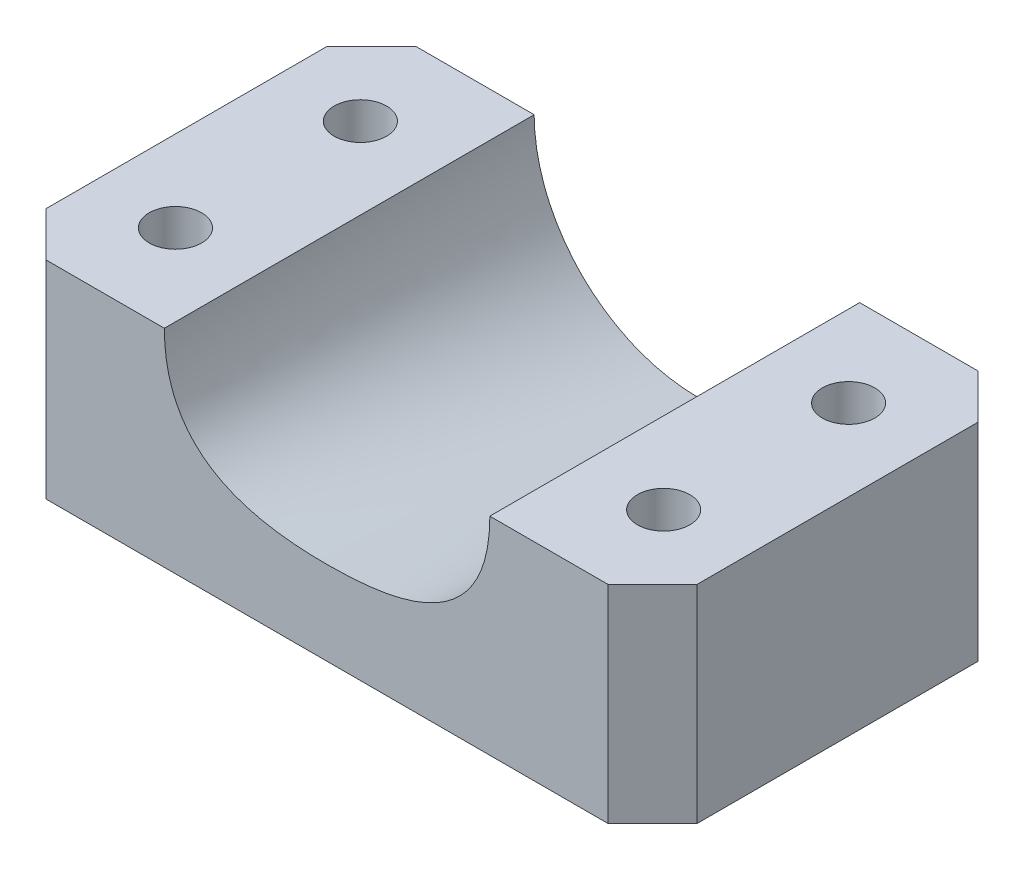
ISO-10303-21;
HEADER;
FILE_DESCRIPTION(('STEP AP214'),'2;1');
FILE_NAME('part.step','',(''),(''),'','','');
FILE_SCHEMA(('AUTOMOTIVE_DESIGN { 1 0 10303 214 1 1 1 1 }'));
ENDSEC;
DATA;
#1=APPLICATION_CONTEXT('core data for automotive mechanical design processes');
#2=APPLICATION_PROTOCOL_DEFINITION('international standard','automotive_design',2000,#1);
#3=PRODUCT_CONTEXT('',#1,'mechanical');
#4=PRODUCT('Part','Part','',(#3));
#5=PRODUCT_RELATED_PRODUCT_CATEGORY('part','',(#4));
#6=PRODUCT_DEFINITION_FORMATION('','',#4);
#7=PRODUCT_DEFINITION_CONTEXT('part definition',#1,'design');
#8=PRODUCT_DEFINITION('design','',#6,#7);
#9=PRODUCT_DEFINITION_SHAPE('','',#8);
#10=(LENGTH_UNIT() NAMED_UNIT(*) SI_UNIT(.MILLI.,.METRE.));
#11=(NAMED_UNIT(*) PLANE_ANGLE_UNIT() SI_UNIT($,.RADIAN.));
#12=(NAMED_UNIT(*) SI_UNIT($,.STERADIAN.) SOLID_ANGLE_UNIT());
#13=UNCERTAINTY_MEASURE_WITH_UNIT(LENGTH_MEASURE(1.E-05),#10,'distance_accuracy_value','');
#14=(GEOMETRIC_REPRESENTATION_CONTEXT(3) GLOBAL_UNCERTAINTY_ASSIGNED_CONTEXT((#13)) GLOBAL_UNIT_ASSIGNED_CONTEXT((#10,
#11,#12)) REPRESENTATION_CONTEXT('',''));
#15=CARTESIAN_POINT('',(0.,0.,0.));
#16=DIRECTION('',(0.,0.,1.));
#17=DIRECTION('',(1.,0.,0.));
#18=AXIS2_PLACEMENT_3D('',#15,#16,#17);
#19=CARTESIAN_POINT('',(0.,0.,0.));
#20=DIRECTION('',(0.,0.,1.));
#21=DIRECTION('',(1.,0.,0.));
#22=AXIS2_PLACEMENT_3D('',#19,#20,#21);
#23=PLANE('',#22);
#24=DIRECTION('',(1.,0.,0.));
#25=VECTOR('',#24,1.);
#26=CARTESIAN_POINT('',(0.,0.,0.));
#27=LINE('',#26,#25);
#28=CARTESIAN_POINT('',(16.51,0.,0.));
#29=VERTEX_POINT('',#28);
#30=CARTESIAN_POINT('',(24.13,0.,0.));
#31=VERTEX_POINT('',#30);
#32=EDGE_CURVE('E394',#29,#31,#27,.T.);
#33=ORIENTED_EDGE('',*,*,#32,.T.);
#34=DIRECTION('',(0.,-1.,0.));
#35=VECTOR('',#34,1.);
#36=CARTESIAN_POINT('',(24.13,-17.78,0.));
#37=LINE('',#36,#35);
#38=CARTESIAN_POINT('',(24.13,-17.78,0.));
#39=VERTEX_POINT('',#38);
#40=EDGE_CURVE('E494',#31,#39,#37,.T.);
#41=ORIENTED_EDGE('',*,*,#40,.T.);
#42=DIRECTION('',(-1.,0.,0.));
#43=VECTOR('',#42,1.);
#44=CARTESIAN_POINT('',(-16.51,-17.78,0.));
#45=LINE('',#44,#43);
#46=CARTESIAN_POINT('',(-24.13,-17.78,0.));
#47=VERTEX_POINT('',#46);
#48=EDGE_CURVE('E278',#39,#47,#45,.T.);
#49=ORIENTED_EDGE('',*,*,#48,.T.);
#50=DIRECTION('',(0.,1.,0.));
#51=VECTOR('',#50,1.);
#52=CARTESIAN_POINT('',(-24.13,0.,0.));
#53=LINE('',#52,#51);
#54=CARTESIAN_POINT('',(-24.13,0.,0.));
#55=VERTEX_POINT('',#54);
#56=EDGE_CURVE('E385',#47,#55,#53,.T.);
#57=ORIENTED_EDGE('',*,*,#56,.T.);
#58=DIRECTION('',(1.,0.,0.));
#59=VECTOR('',#58,1.);
#60=CARTESIAN_POINT('',(0.,0.,0.));
#61=LINE('',#60,#59);
#62=CARTESIAN_POINT('',(-16.51,0.,0.));
#63=VERTEX_POINT('',#62);
#64=EDGE_CURVE('E300',#55,#63,#61,.T.);
#65=ORIENTED_EDGE('',*,*,#64,.T.);
#66=DIRECTION('',(-1.,0.,0.));
#67=VECTOR('',#66,1.);
#68=CARTESIAN_POINT('',(-13.97,0.,0.));
#69=LINE('',#68,#67);
#70=CARTESIAN_POINT('',(-13.97,0.,0.));
#71=VERTEX_POINT('',#70);
#72=EDGE_CURVE('E389',#71,#63,#69,.T.);
#73=ORIENTED_EDGE('',*,*,#72,.F.);
#74=CARTESIAN_POINT('',(0.,0.,0.));
#75=DIRECTION('',(0.,0.,-1.));
#76=DIRECTION('',(1.,0.,0.));
#77=AXIS2_PLACEMENT_3D('',#74,#75,#76);
#78=CIRCLE('',#77,13.97);
#79=CARTESIAN_POINT('',(13.97,0.,0.));
#80=VERTEX_POINT('',#79);
#81=EDGE_CURVE('E313',#80,#71,#78,.T.);
#82=ORIENTED_EDGE('',*,*,#81,.F.);
#83=DIRECTION('',(-1.,0.,0.));
#84=VECTOR('',#83,1.);
#85=CARTESIAN_POINT('',(13.97,0.,0.));
#86=LINE('',#85,#84);
#87=EDGE_CURVE('E393',#29,#80,#86,.T.);
#88=ORIENTED_EDGE('',*,*,#87,.F.);
#89=EDGE_LOOP('',(#33,#41,#49,#57,#65,#73,#82,#88));
#90=FACE_BOUND('',#89,.T.);
#91=ADVANCED_FACE('F120',(#90),#23,.F.);
#92=CARTESIAN_POINT('',(9.35520056705941,-8.74630496496654,31.75));
#93=DIRECTION('',(0.,0.,1.));
#94=DIRECTION('',(1.,0.,0.));
#95=AXIS2_PLACEMENT_3D('',#92,#93,#94);
#96=PLANE('',#95);
#97=DIRECTION('',(1.,0.,0.));
#98=VECTOR('',#97,1.);
#99=CARTESIAN_POINT('',(-16.51,-17.78,31.75));
#100=LINE('',#99,#98);
#101=CARTESIAN_POINT('',(-24.13,-17.78,31.75));
#102=VERTEX_POINT('',#101);
#103=CARTESIAN_POINT('',(24.13,-17.78,31.75));
#104=VERTEX_POINT('',#103);
#105=EDGE_CURVE('E309',#102,#104,#100,.T.);
#106=ORIENTED_EDGE('',*,*,#105,.T.);
#107=DIRECTION('',(0.,1.,0.));
#108=VECTOR('',#107,1.);
#109=CARTESIAN_POINT('',(24.13,-8.74630496496654,31.75));
#110=LINE('',#109,#108);
#111=CARTESIAN_POINT('',(24.13,0.,31.75));
#112=VERTEX_POINT('',#111);
#113=EDGE_CURVE('E220',#104,#112,#110,.T.);
#114=ORIENTED_EDGE('',*,*,#113,.T.);
#115=DIRECTION('',(1.,0.,0.));
#116=VECTOR('',#115,1.);
#117=CARTESIAN_POINT('',(0.,0.,31.75));
#118=LINE('',#117,#116);
#119=CARTESIAN_POINT('',(16.51,0.,31.75));
#120=VERTEX_POINT('',#119);
#121=EDGE_CURVE('E211',#120,#112,#118,.T.);
#122=ORIENTED_EDGE('',*,*,#121,.F.);
#123=DIRECTION('',(1.,0.,0.));
#124=VECTOR('',#123,1.);
#125=CARTESIAN_POINT('',(13.97,0.,31.75));
#126=LINE('',#125,#124);
#127=CARTESIAN_POINT('',(13.97,0.,31.75));
#128=VERTEX_POINT('',#127);
#129=EDGE_CURVE('E216',#128,#120,#126,.T.);
#130=ORIENTED_EDGE('',*,*,#129,.F.);
#131=CARTESIAN_POINT('',(0.,-10.58164,31.75));
#132=CARTESIAN_POINT('',(6.32053484549176,-10.58164,31.75));
#133=CARTESIAN_POINT('',(13.97,-9.2146265732441,31.75));
#134=CARTESIAN_POINT('',(13.97,0.,31.75));
#135=B_SPLINE_CURVE_WITH_KNOTS('',3,(#131,#132,#133,#134),.UNSPECIFIED.,.F.,.F.,(4,4),(0.,1.),.UNSPECIFIED.);
#136=CARTESIAN_POINT('',(-3.13876099720667E-10,-10.5816399999999,31.75));
#137=VERTEX_POINT('',#136);
#138=EDGE_CURVE('E311',#137,#128,#135,.T.);
#139=ORIENTED_EDGE('',*,*,#138,.F.);
#140=CARTESIAN_POINT('',(-13.97,0.,31.75));
#141=CARTESIAN_POINT('',(-13.97,-9.2146265732441,31.75));
#142=CARTESIAN_POINT('',(-6.32053484549176,-10.58164,31.75));
#143=CARTESIAN_POINT('',(0.,-10.58164,31.75));
#144=B_SPLINE_CURVE_WITH_KNOTS('',3,(#140,#141,#142,#143),.UNSPECIFIED.,.F.,.F.,(4,4),(0.,1.),.UNSPECIFIED.);
#145=CARTESIAN_POINT('',(-13.97,0.,31.75));
#146=VERTEX_POINT('',#145);
#147=EDGE_CURVE('E334',#146,#137,#144,.T.);
#148=ORIENTED_EDGE('',*,*,#147,.F.);
#149=DIRECTION('',(1.,0.,0.));
#150=VECTOR('',#149,1.);
#151=CARTESIAN_POINT('',(-13.97,0.,31.75));
#152=LINE('',#151,#150);
#153=CARTESIAN_POINT('',(-16.51,0.,31.75));
#154=VERTEX_POINT('',#153);
#155=EDGE_CURVE('E233',#154,#146,#152,.T.);
#156=ORIENTED_EDGE('',*,*,#155,.F.);
#157=DIRECTION('',(1.,0.,0.));
#158=VECTOR('',#157,1.);
#159=CARTESIAN_POINT('',(0.,0.,31.75));
#160=LINE('',#159,#158);
#161=CARTESIAN_POINT('',(-24.13,0.,31.75));
#162=VERTEX_POINT('',#161);
#163=EDGE_CURVE('E275',#162,#154,#160,.T.);
#164=ORIENTED_EDGE('',*,*,#163,.F.);
#165=DIRECTION('',(0.,-1.,0.));
#166=VECTOR('',#165,1.);
#167=CARTESIAN_POINT('',(-24.13,-17.78,31.75));
#168=LINE('',#167,#166);
#169=EDGE_CURVE('E282',#162,#102,#168,.T.);
#170=ORIENTED_EDGE('',*,*,#169,.T.);
#171=EDGE_LOOP('',(#106,#114,#122,#130,#139,#148,#156,#164,#170));
#172=FACE_BOUND('',#171,.T.);
#173=ADVANCED_FACE('F214',(#172),#96,.T.);
#174=CARTESIAN_POINT('',(-13.97,0.,31.75));
#175=CARTESIAN_POINT('',(-13.97,0.,21.1666666666667));
#176=CARTESIAN_POINT('',(-13.97,0.,10.5833333333333));
#177=CARTESIAN_POINT('',(-13.97,0.,0.));
#178=CARTESIAN_POINT('',(-13.97,-0.840095515855359,31.75));
#179=CARTESIAN_POINT('',(-13.97,-0.863404060491295,21.1666666666667));
#180=CARTESIAN_POINT('',(-13.97,-0.886712605127232,10.5833333333333));
#181=CARTESIAN_POINT('',(-13.97,-0.910021149763169,0.));
#182=CARTESIAN_POINT('',(-13.8438433699331,-2.51975749680031,31.75));
#183=CARTESIAN_POINT('',(-13.8258844655216,-2.59056841628014,21.1666666666667));
#184=CARTESIAN_POINT('',(-13.8079255611101,-2.66137933575997,10.5833333333333));
#185=CARTESIAN_POINT('',(-13.7899666566986,-2.73219025523981,0.));
#186=CARTESIAN_POINT('',(-13.121962996505,-4.9472410895318,31.75));
#187=CARTESIAN_POINT('',(-13.0803100955002,-5.08706707169347,21.1666666666667));
#188=CARTESIAN_POINT('',(-13.0386571944954,-5.22689305385514,10.5833333333333));
#189=CARTESIAN_POINT('',(-12.9970042934906,-5.36671903601681,0.));
#190=CARTESIAN_POINT('',(-11.7260848051176,-7.07015736297371,31.75));
#191=CARTESIAN_POINT('',(-11.7168289579699,-7.31257745667148,21.1666666666667));
#192=CARTESIAN_POINT('',(-11.7075731108223,-7.55499755036924,10.5833333333333));
#193=CARTESIAN_POINT('',(-11.6983172636746,-7.79741764406701,0.));
#194=CARTESIAN_POINT('',(-9.74284532048192,-8.64673120584234,31.75));
#195=CARTESIAN_POINT('',(-9.81274858357212,-9.07568793097856,21.1666666666666));
#196=CARTESIAN_POINT('',(-9.88265184666231,-9.50464465611478,10.5833333333333));
#197=CARTESIAN_POINT('',(-9.9525551097525,-9.933601381251,0.));
#198=CARTESIAN_POINT('',(-7.43900100610257,-9.66251280676886,31.75));
#199=CARTESIAN_POINT('',(-7.56545646214368,-10.3365370543224,21.1666666666667));
#200=CARTESIAN_POINT('',(-7.6919119181848,-11.0105613018759,10.5833333333333));
#201=CARTESIAN_POINT('',(-7.81836737422592,-11.6845855494294,0.));
#202=CARTESIAN_POINT('',(-4.99848521849991,-10.2504181856223,31.7499999999999));
#203=CARTESIAN_POINT('',(-5.12751445884373,-11.1635094486578,21.1666666666666));
#204=CARTESIAN_POINT('',(-5.25654369918754,-12.0766007116933,10.5833333333333));
#205=CARTESIAN_POINT('',(-5.38557293953136,-12.9896919747289,0.));
#206=CARTESIAN_POINT('',(-2.50709019654424,-10.5339531577543,31.75));
#207=CARTESIAN_POINT('',(-2.5860570270646,-11.6187162662616,21.1666666666667));
#208=CARTESIAN_POINT('',(-2.66502385758496,-12.7034793747689,10.5833333333333));
#209=CARTESIAN_POINT('',(-2.74399068810532,-13.7882424832762,0.));
#210=CARTESIAN_POINT('',(-0.835944852082541,-10.58164,31.75));
#211=CARTESIAN_POINT('',(-0.862074118306371,-11.7110933333333,21.1666666666667));
#212=CARTESIAN_POINT('',(-0.888203384530202,-12.8405466666667,10.5833333333333));
#213=CARTESIAN_POINT('',(-0.914332650754032,-13.97,0.));
#214=CARTESIAN_POINT('',(0.835941568318076,-10.58164,31.75));
#215=CARTESIAN_POINT('',(0.862073065920245,-11.7110933333333,21.1666666666667));
#216=CARTESIAN_POINT('',(0.888204563522414,-12.8405466666667,10.5833333333333));
#217=CARTESIAN_POINT('',(0.914336061124583,-13.97,0.));
#218=CARTESIAN_POINT('',(2.50708209507719,-10.5339535418456,31.75));
#219=CARTESIAN_POINT('',(2.58605440240321,-11.6187160995219,21.1666666666666));
#220=CARTESIAN_POINT('',(2.66502670972924,-12.7034786571981,10.5833333333333));
#221=CARTESIAN_POINT('',(2.74399901705527,-13.7882412148743,0.));
#222=CARTESIAN_POINT('',(4.99847417914798,-10.2504199882974,31.7500000000001));
#223=CARTESIAN_POINT('',(5.12751074102163,-11.1635091576084,21.1666666666667));
#224=CARTESIAN_POINT('',(5.25654730289527,-12.0765983269193,10.5833333333334));
#225=CARTESIAN_POINT('',(5.38558386476892,-12.9896874962303,0.));
#226=CARTESIAN_POINT('',(7.43899043686767,-9.66251631479772,31.75));
#227=CARTESIAN_POINT('',(7.56545263760285,-10.3365372268826,21.1666666666666));
#228=CARTESIAN_POINT('',(7.69191483833804,-11.0105581389675,10.5833333333333));
#229=CARTESIAN_POINT('',(7.81837703907323,-11.6845790510523,0.));
#230=CARTESIAN_POINT('',(9.74283767278819,-8.64673596757488,31.7500000000001));
#231=CARTESIAN_POINT('',(9.81274563101235,-9.07568882505128,21.1666666666667));
#232=CARTESIAN_POINT('',(9.88265358923652,-9.50464168252768,10.5833333333334));
#233=CARTESIAN_POINT('',(9.95256154746068,-9.93359454000408,0.));
#234=CARTESIAN_POINT('',(11.7260812143619,-7.07016183085577,31.75));
#235=CARTESIAN_POINT('',(11.7168276087158,-7.31257876182029,21.1666666666666));
#236=CARTESIAN_POINT('',(11.7075740030698,-7.55499569278481,10.5833333333333));
#237=CARTESIAN_POINT('',(11.6983203974238,-7.79741262374933,0.));
#238=CARTESIAN_POINT('',(13.1219623380854,-4.9472433033498,31.75));
#239=CARTESIAN_POINT('',(13.0803098785834,-5.08706777799279,21.1666666666667));
#240=CARTESIAN_POINT('',(13.0386574190813,-5.22689225263577,10.5833333333333));
#241=CARTESIAN_POINT('',(12.9970049595792,-5.36671672727875,0.));
#242=CARTESIAN_POINT('',(13.8438434906881,-2.5197573764625,31.75));
#243=CARTESIAN_POINT('',(13.82588452864,-2.59056834283601,21.1666666666666));
#244=CARTESIAN_POINT('',(13.8079255665918,-2.66137930920951,10.5833333333333));
#245=CARTESIAN_POINT('',(13.7899666045437,-2.73219027558302,0.));
#246=CARTESIAN_POINT('',(13.97,-0.840095130625828,31.75));
#247=CARTESIAN_POINT('',(13.97,-0.863403925830594,21.1666666666667));
#248=CARTESIAN_POINT('',(13.97,-0.886712721035359,10.5833333333333));
#249=CARTESIAN_POINT('',(13.97,-0.910021516240125,0.));
#250=CARTESIAN_POINT('',(13.97,0.,31.75));
#251=CARTESIAN_POINT('',(13.97,0.,21.1666666666667));
#252=CARTESIAN_POINT('',(13.97,0.,10.5833333333333));
#253=CARTESIAN_POINT('',(13.97,0.,0.));
#254=B_SPLINE_SURFACE_WITH_KNOTS('',3,3,((#174,#175,#176,#177),(#178,#179,#180,#181),(#182,#183,
#184,#185),(#186,#187,#188,#189),(#190,#191,#192,#193),(#194,#195,#196,#197),(#198,#199,#200,
#201),(#202,#203,#204,#205),(#206,#207,#208,#209),(#210,#211,#212,#213),(#214,#215,#216,#217),
(#218,#219,#220,#221),(#222,#223,#224,#225),(#226,#227,#228,#229),(#230,#231,#232,#233),(#234,
#235,#236,#237),(#238,#239,#240,#241),(#242,#243,#244,#245),(#246,#247,#248,#249),(#250,#251,
#252,#253)),.UNSPECIFIED.,.F.,.F.,.F.,(4,1,1,1,1,1,1,1,2,1,1,1,1,1,1,1,4),(4,4),
(0.575704385482283,0.602222811934084,0.628741238385884,0.655259664837685,0.681778091289485,
0.708296517741286,0.734814944193086,0.761333370644887,0.787851797096688,0.814370322459602,
0.840888847822516,0.86740737318543,0.893925898548344,0.920444423911258,0.946962949274172,
0.973481474637086,1.),(0.,1.),.UNSPECIFIED.);
#255=CARTESIAN_POINT('',(13.97,0.,31.75));
#256=CARTESIAN_POINT('',(13.97,0.,21.1666666666667));
#257=CARTESIAN_POINT('',(13.97,0.,10.5833333333333));
#258=CARTESIAN_POINT('',(13.97,0.,0.));
#259=B_SPLINE_CURVE_WITH_KNOTS('',3,(#255,#256,#257,#258),.UNSPECIFIED.,.F.,.F.,(4,4),(0.,1.),.UNSPECIFIED.);
#260=EDGE_CURVE('E231',#128,#80,#259,.T.);
#261=CARTESIAN_POINT('',(-13.97,0.,31.75));
#262=CARTESIAN_POINT('',(-13.97,0.,21.1666666666667));
#263=CARTESIAN_POINT('',(-13.97,0.,10.5833333333333));
#264=CARTESIAN_POINT('',(-13.97,0.,0.));
#265=B_SPLINE_CURVE_WITH_KNOTS('',3,(#261,#262,#263,#264),.UNSPECIFIED.,.F.,.F.,(4,4),(0.,1.),.UNSPECIFIED.);
#266=EDGE_CURVE('E232',#146,#71,#265,.T.);
#267=ORIENTED_EDGE('',*,*,#147,.T.);
#268=ORIENTED_EDGE('',*,*,#138,.T.);
#269=ORIENTED_EDGE('',*,*,#260,.T.);
#270=ORIENTED_EDGE('',*,*,#81,.T.);
#271=ORIENTED_EDGE('',*,*,#266,.F.);
#272=EDGE_LOOP('',(#267,#268,#269,#270,#271));
#273=FACE_BOUND('',#272,.T.);
#274=ADVANCED_FACE('F340',(#273),#254,.T.);
#275=CARTESIAN_POINT('',(-16.51,0.,31.75));
#276=DIRECTION('',(0.,1.,0.));
#277=DIRECTION('',(1.,0.,0.));
#278=AXIS2_PLACEMENT_3D('',#275,#276,#277);
#279=PLANE('',#278);
#280=CARTESIAN_POINT('',(-20.955,0.,7.9375));
#281=DIRECTION('',(0.,1.,0.));
#282=DIRECTION('',(1.,0.,0.));
#283=AXIS2_PLACEMENT_3D('',#280,#281,#282);
#284=CIRCLE('',#283,2.25);
#285=CARTESIAN_POINT('',(-18.705,0.,7.9375));
#286=VERTEX_POINT('',#285);
#287=EDGE_CURVE('E680',#286,#286,#284,.T.);
#288=ORIENTED_EDGE('',*,*,#287,.F.);
#289=EDGE_LOOP('',(#288));
#290=FACE_BOUND('',#289,.T.);
#291=CARTESIAN_POINT('',(-20.955,0.,23.8125));
#292=DIRECTION('',(0.,1.,0.));
#293=DIRECTION('',(-1.,0.,0.));
#294=AXIS2_PLACEMENT_3D('',#291,#292,#293);
#295=CIRCLE('',#294,2.25);
#296=CARTESIAN_POINT('',(-23.205,0.,23.8125));
#297=VERTEX_POINT('',#296);
#298=EDGE_CURVE('E686',#297,#297,#295,.T.);
#299=ORIENTED_EDGE('',*,*,#298,.F.);
#300=EDGE_LOOP('',(#299));
#301=FACE_BOUND('',#300,.T.);
#302=DIRECTION('',(0.,0.,1.));
#303=VECTOR('',#302,1.);
#304=CARTESIAN_POINT('',(-27.94,0.,0.));
#305=LINE('',#304,#303);
#306=CARTESIAN_POINT('',(-27.94,0.,3.80999999999999));
#307=VERTEX_POINT('',#306);
#308=CARTESIAN_POINT('',(-27.94,0.,27.94));
#309=VERTEX_POINT('',#308);
#310=EDGE_CURVE('E279',#307,#309,#305,.T.);
#311=ORIENTED_EDGE('',*,*,#310,.T.);
#312=DIRECTION('',(0.707106781186547,0.,0.707106781186548));
#313=VECTOR('',#312,1.);
#314=CARTESIAN_POINT('',(-20.32,0.,35.56));
#315=LINE('',#314,#313);
#316=EDGE_CURVE('E13',#309,#162,#315,.T.);
#317=ORIENTED_EDGE('',*,*,#316,.T.);
#318=ORIENTED_EDGE('',*,*,#163,.T.);
#319=ORIENTED_EDGE('',*,*,#155,.T.);
#320=ORIENTED_EDGE('',*,*,#266,.T.);
#321=ORIENTED_EDGE('',*,*,#72,.T.);
#322=ORIENTED_EDGE('',*,*,#64,.F.);
#323=DIRECTION('',(0.707106781186548,0.,-0.707106781186547));
#324=VECTOR('',#323,1.);
#325=CARTESIAN_POINT('',(-36.195,0.,12.065));
#326=LINE('',#325,#324);
#327=EDGE_CURVE('E128',#55,#307,#326,.F.);
#328=ORIENTED_EDGE('',*,*,#327,.T.);
#329=EDGE_LOOP('',(#311,#317,#318,#319,#320,#321,#322,#328));
#330=FACE_BOUND('',#329,.T.);
#331=ADVANCED_FACE('F255',(#290,#301,#330),#279,.T.);
#332=CARTESIAN_POINT('',(13.97,0.,31.75));
#333=DIRECTION('',(0.,1.,0.));
#334=DIRECTION('',(1.,0.,0.));
#335=AXIS2_PLACEMENT_3D('',#332,#333,#334);
#336=PLANE('',#335);
#337=CARTESIAN_POINT('',(20.955,0.,23.8125));
#338=DIRECTION('',(0.,1.,0.));
#339=DIRECTION('',(1.,0.,0.));
#340=AXIS2_PLACEMENT_3D('',#337,#338,#339);
#341=CIRCLE('',#340,2.25);
#342=CARTESIAN_POINT('',(23.205,0.,23.8125));
#343=VERTEX_POINT('',#342);
#344=EDGE_CURVE('E692',#343,#343,#341,.T.);
#345=ORIENTED_EDGE('',*,*,#344,.F.);
#346=EDGE_LOOP('',(#345));
#347=FACE_BOUND('',#346,.T.);
#348=CARTESIAN_POINT('',(20.955,0.,7.9375));
#349=DIRECTION('',(0.,1.,0.));
#350=DIRECTION('',(-1.,0.,0.));
#351=AXIS2_PLACEMENT_3D('',#348,#349,#350);
#352=CIRCLE('',#351,2.25);
#353=CARTESIAN_POINT('',(18.705,0.,7.9375));
#354=VERTEX_POINT('',#353);
#355=EDGE_CURVE('E674',#354,#354,#352,.T.);
#356=ORIENTED_EDGE('',*,*,#355,.F.);
#357=EDGE_LOOP('',(#356));
#358=FACE_BOUND('',#357,.T.);
#359=DIRECTION('',(0.,0.,1.));
#360=VECTOR('',#359,1.);
#361=CARTESIAN_POINT('',(27.94,0.,0.));
#362=LINE('',#361,#360);
#363=CARTESIAN_POINT('',(27.94,0.,3.81000000000002));
#364=VERTEX_POINT('',#363);
#365=CARTESIAN_POINT('',(27.94,0.,27.94));
#366=VERTEX_POINT('',#365);
#367=EDGE_CURVE('E303',#364,#366,#362,.T.);
#368=ORIENTED_EDGE('',*,*,#367,.F.);
#369=DIRECTION('',(-0.707106781186547,0.,-0.707106781186548));
#370=VECTOR('',#369,1.);
#371=CARTESIAN_POINT('',(34.925,0.,10.795));
#372=LINE('',#371,#370);
#373=EDGE_CURVE('E280',#364,#31,#372,.T.);
#374=ORIENTED_EDGE('',*,*,#373,.T.);
#375=ORIENTED_EDGE('',*,*,#32,.F.);
#376=ORIENTED_EDGE('',*,*,#87,.T.);
#377=ORIENTED_EDGE('',*,*,#260,.F.);
#378=ORIENTED_EDGE('',*,*,#129,.T.);
#379=ORIENTED_EDGE('',*,*,#121,.T.);
#380=DIRECTION('',(-0.70710678118655,0.,0.707106781186546));
#381=VECTOR('',#380,1.);
#382=CARTESIAN_POINT('',(19.05,0.,36.83));
#383=LINE('',#382,#381);
#384=EDGE_CURVE('E502',#112,#366,#383,.F.);
#385=ORIENTED_EDGE('',*,*,#384,.T.);
#386=EDGE_LOOP('',(#368,#374,#375,#376,#377,#378,#379,#385));
#387=FACE_BOUND('',#386,.T.);
#388=ADVANCED_FACE('F229',(#347,#358,#387),#336,.T.);
#389=CARTESIAN_POINT('',(0.,-17.78,0.));
#390=DIRECTION('',(0.,1.,0.));
#391=DIRECTION('',(0.,0.,1.));
#392=AXIS2_PLACEMENT_3D('',#389,#390,#391);
#393=PLANE('',#392);
#394=CARTESIAN_POINT('',(-20.955,-17.7800000000001,7.9375));
#395=DIRECTION('',(0.,1.,0.));
#396=DIRECTION('',(1.,0.,0.));
#397=AXIS2_PLACEMENT_3D('',#394,#395,#396);
#398=CIRCLE('',#397,2.25);
#399=CARTESIAN_POINT('',(-18.705,-17.7800000000001,7.9375));
#400=VERTEX_POINT('',#399);
#401=EDGE_CURVE('E683',#400,#400,#398,.T.);
#402=ORIENTED_EDGE('',*,*,#401,.T.);
#403=EDGE_LOOP('',(#402));
#404=FACE_BOUND('',#403,.T.);
#405=CARTESIAN_POINT('',(-20.955,-17.7800000000001,23.8125));
#406=DIRECTION('',(0.,1.,0.));
#407=DIRECTION('',(-1.,0.,0.));
#408=AXIS2_PLACEMENT_3D('',#405,#406,#407);
#409=CIRCLE('',#408,2.25);
#410=CARTESIAN_POINT('',(-23.205,-17.7800000000001,23.8125));
#411=VERTEX_POINT('',#410);
#412=EDGE_CURVE('E689',#411,#411,#409,.T.);
#413=ORIENTED_EDGE('',*,*,#412,.T.);
#414=EDGE_LOOP('',(#413));
#415=FACE_BOUND('',#414,.T.);
#416=CARTESIAN_POINT('',(20.955,-17.78,23.8125));
#417=DIRECTION('',(0.,1.,0.));
#418=DIRECTION('',(1.,0.,0.));
#419=AXIS2_PLACEMENT_3D('',#416,#417,#418);
#420=CIRCLE('',#419,2.25);
#421=CARTESIAN_POINT('',(23.205,-17.78,23.8125));
#422=VERTEX_POINT('',#421);
#423=EDGE_CURVE('E677',#422,#422,#420,.T.);
#424=ORIENTED_EDGE('',*,*,#423,.T.);
#425=EDGE_LOOP('',(#424));
#426=FACE_BOUND('',#425,.T.);
#427=CARTESIAN_POINT('',(20.955,-17.78,7.9375));
#428=DIRECTION('',(0.,1.,0.));
#429=DIRECTION('',(-1.,0.,0.));
#430=AXIS2_PLACEMENT_3D('',#427,#428,#429);
#431=CIRCLE('',#430,2.25);
#432=CARTESIAN_POINT('',(18.705,-17.78,7.9375));
#433=VERTEX_POINT('',#432);
#434=EDGE_CURVE('E224',#433,#433,#431,.T.);
#435=ORIENTED_EDGE('',*,*,#434,.T.);
#436=EDGE_LOOP('',(#435));
#437=FACE_BOUND('',#436,.T.);
#438=ORIENTED_EDGE('',*,*,#48,.F.);
#439=DIRECTION('',(0.707106781186547,0.,0.707106781186548));
#440=VECTOR('',#439,1.);
#441=CARTESIAN_POINT('',(24.13,-17.78,0.));
#442=LINE('',#441,#440);
#443=CARTESIAN_POINT('',(27.94,-17.78,3.81000000000002));
#444=VERTEX_POINT('',#443);
#445=EDGE_CURVE('E492',#39,#444,#442,.T.);
#446=ORIENTED_EDGE('',*,*,#445,.T.);
#447=DIRECTION('',(0.,0.,1.));
#448=VECTOR('',#447,1.);
#449=CARTESIAN_POINT('',(27.94,-17.78,0.));
#450=LINE('',#449,#448);
#451=CARTESIAN_POINT('',(27.94,-17.78,27.94));
#452=VERTEX_POINT('',#451);
#453=EDGE_CURVE('E223',#444,#452,#450,.T.);
#454=ORIENTED_EDGE('',*,*,#453,.T.);
#455=DIRECTION('',(0.70710678118655,0.,-0.707106781186546));
#456=VECTOR('',#455,1.);
#457=CARTESIAN_POINT('',(27.94,-17.78,27.94));
#458=LINE('',#457,#456);
#459=EDGE_CURVE('E490',#452,#104,#458,.F.);
#460=ORIENTED_EDGE('',*,*,#459,.T.);
#461=ORIENTED_EDGE('',*,*,#105,.F.);
#462=DIRECTION('',(-0.707106781186547,0.,-0.707106781186548));
#463=VECTOR('',#462,1.);
#464=CARTESIAN_POINT('',(-24.13,-17.78,31.75));
#465=LINE('',#464,#463);
#466=CARTESIAN_POINT('',(-27.94,-17.78,27.94));
#467=VERTEX_POINT('',#466);
#468=EDGE_CURVE('E299',#102,#467,#465,.T.);
#469=ORIENTED_EDGE('',*,*,#468,.T.);
#470=DIRECTION('',(0.,0.,1.));
#471=VECTOR('',#470,1.);
#472=CARTESIAN_POINT('',(-27.94,-17.78,0.));
#473=LINE('',#472,#471);
#474=CARTESIAN_POINT('',(-27.94,-17.78,3.80999999999999));
#475=VERTEX_POINT('',#474);
#476=EDGE_CURVE('E292',#475,#467,#473,.T.);
#477=ORIENTED_EDGE('',*,*,#476,.F.);
#478=DIRECTION('',(-0.707106781186548,0.,0.707106781186547));
#479=VECTOR('',#478,1.);
#480=CARTESIAN_POINT('',(-27.94,-17.78,3.80999999999999));
#481=LINE('',#480,#479);
#482=EDGE_CURVE('E296',#475,#47,#481,.F.);
#483=ORIENTED_EDGE('',*,*,#482,.T.);
#484=EDGE_LOOP('',(#438,#446,#454,#460,#461,#469,#477,#483));
#485=FACE_BOUND('',#484,.T.);
#486=ADVANCED_FACE('F254',(#404,#415,#426,#437,#485),#393,.F.);
#487=CARTESIAN_POINT('',(-27.94,33.7447388491895,0.));
#488=DIRECTION('',(1.,0.,0.));
#489=DIRECTION('',(0.,0.,-1.));
#490=AXIS2_PLACEMENT_3D('',#487,#488,#489);
#491=PLANE('',#490);
#492=ORIENTED_EDGE('',*,*,#476,.T.);
#493=DIRECTION('',(0.,1.,0.));
#494=VECTOR('',#493,1.);
#495=CARTESIAN_POINT('',(-27.94,0.,27.94));
#496=LINE('',#495,#494);
#497=EDGE_CURVE('E135',#467,#309,#496,.T.);
#498=ORIENTED_EDGE('',*,*,#497,.T.);
#499=ORIENTED_EDGE('',*,*,#310,.F.);
#500=DIRECTION('',(0.,-1.,0.));
#501=VECTOR('',#500,1.);
#502=CARTESIAN_POINT('',(-27.94,33.7447388491895,3.80999999999999));
#503=LINE('',#502,#501);
#504=EDGE_CURVE('E286',#307,#475,#503,.T.);
#505=ORIENTED_EDGE('',*,*,#504,.T.);
#506=EDGE_LOOP('',(#492,#498,#499,#505));
#507=FACE_BOUND('',#506,.T.);
#508=ADVANCED_FACE('F291',(#507),#491,.F.);
#509=CARTESIAN_POINT('',(27.94,33.7447388491895,0.));
#510=DIRECTION('',(1.,0.,0.));
#511=DIRECTION('',(0.,0.,-1.));
#512=AXIS2_PLACEMENT_3D('',#509,#510,#511);
#513=PLANE('',#512);
#514=ORIENTED_EDGE('',*,*,#453,.F.);
#515=DIRECTION('',(0.,1.,0.));
#516=VECTOR('',#515,1.);
#517=CARTESIAN_POINT('',(27.94,0.,3.81000000000002));
#518=LINE('',#517,#516);
#519=EDGE_CURVE('E501',#444,#364,#518,.T.);
#520=ORIENTED_EDGE('',*,*,#519,.T.);
#521=ORIENTED_EDGE('',*,*,#367,.T.);
#522=DIRECTION('',(0.,-1.,0.));
#523=VECTOR('',#522,1.);
#524=CARTESIAN_POINT('',(27.94,33.7447388491895,27.94));
#525=LINE('',#524,#523);
#526=EDGE_CURVE('E498',#366,#452,#525,.T.);
#527=ORIENTED_EDGE('',*,*,#526,.T.);
#528=EDGE_LOOP('',(#514,#520,#521,#527));
#529=FACE_BOUND('',#528,.T.);
#530=ADVANCED_FACE('F548',(#529),#513,.T.);
#531=CARTESIAN_POINT('',(20.955,-17.78,7.9375));
#532=DIRECTION('',(0.,1.,0.));
#533=DIRECTION('',(-1.,0.,0.));
#534=AXIS2_PLACEMENT_3D('',#531,#532,#533);
#535=CYLINDRICAL_SURFACE('',#534,2.25);
#536=ORIENTED_EDGE('',*,*,#434,.F.);
#537=EDGE_LOOP('',(#536));
#538=FACE_BOUND('',#537,.T.);
#539=ORIENTED_EDGE('',*,*,#355,.T.);
#540=EDGE_LOOP('',(#539));
#541=FACE_BOUND('',#540,.T.);
#542=ADVANCED_FACE('F555',(#538,#541),#535,.F.);
#543=CARTESIAN_POINT('',(20.955,-17.78,23.8125));
#544=DIRECTION('',(0.,1.,0.));
#545=DIRECTION('',(-1.,0.,0.));
#546=AXIS2_PLACEMENT_3D('',#543,#544,#545);
#547=CYLINDRICAL_SURFACE('',#546,2.25);
#548=ORIENTED_EDGE('',*,*,#423,.F.);
#549=EDGE_LOOP('',(#548));
#550=FACE_BOUND('',#549,.T.);
#551=ORIENTED_EDGE('',*,*,#344,.T.);
#552=EDGE_LOOP('',(#551));
#553=FACE_BOUND('',#552,.T.);
#554=ADVANCED_FACE('F563',(#550,#553),#547,.F.);
#555=CARTESIAN_POINT('',(-20.955,-17.7800000000001,23.8125));
#556=DIRECTION('',(0.,1.,0.));
#557=DIRECTION('',(-1.,0.,0.));
#558=AXIS2_PLACEMENT_3D('',#555,#556,#557);
#559=CYLINDRICAL_SURFACE('',#558,2.25);
#560=ORIENTED_EDGE('',*,*,#412,.F.);
#561=EDGE_LOOP('',(#560));
#562=FACE_BOUND('',#561,.T.);
#563=ORIENTED_EDGE('',*,*,#298,.T.);
#564=EDGE_LOOP('',(#563));
#565=FACE_BOUND('',#564,.T.);
#566=ADVANCED_FACE('F571',(#562,#565),#559,.F.);
#567=CARTESIAN_POINT('',(-20.955,-17.7800000000001,7.9375));
#568=DIRECTION('',(0.,1.,0.));
#569=DIRECTION('',(-1.,0.,0.));
#570=AXIS2_PLACEMENT_3D('',#567,#568,#569);
#571=CYLINDRICAL_SURFACE('',#570,2.25);
#572=ORIENTED_EDGE('',*,*,#401,.F.);
#573=EDGE_LOOP('',(#572));
#574=FACE_BOUND('',#573,.T.);
#575=ORIENTED_EDGE('',*,*,#287,.T.);
#576=EDGE_LOOP('',(#575));
#577=FACE_BOUND('',#576,.T.);
#578=ADVANCED_FACE('F579',(#574,#577),#571,.F.);
#579=CARTESIAN_POINT('',(24.13,0.,0.));
#580=DIRECTION('',(0.707106781186548,0.,-0.707106781186547));
#581=DIRECTION('',(0.,1.,0.));
#582=AXIS2_PLACEMENT_3D('',#579,#580,#581);
#583=PLANE('',#582);
#584=ORIENTED_EDGE('',*,*,#373,.F.);
#585=ORIENTED_EDGE('',*,*,#519,.F.);
#586=ORIENTED_EDGE('',*,*,#445,.F.);
#587=ORIENTED_EDGE('',*,*,#40,.F.);
#588=EDGE_LOOP('',(#584,#585,#586,#587));
#589=FACE_BOUND('',#588,.T.);
#590=ADVANCED_FACE('F259',(#589),#583,.T.);
#591=CARTESIAN_POINT('',(27.94,33.7447388491895,27.94));
#592=DIRECTION('',(-0.707106781186546,0.,-0.70710678118655));
#593=DIRECTION('',(0.,-1.,0.));
#594=AXIS2_PLACEMENT_3D('',#591,#592,#593);
#595=PLANE('',#594);
#596=ORIENTED_EDGE('',*,*,#384,.F.);
#597=ORIENTED_EDGE('',*,*,#113,.F.);
#598=ORIENTED_EDGE('',*,*,#459,.F.);
#599=ORIENTED_EDGE('',*,*,#526,.F.);
#600=EDGE_LOOP('',(#596,#597,#598,#599));
#601=FACE_BOUND('',#600,.T.);
#602=ADVANCED_FACE('F514',(#601),#595,.F.);
#603=CARTESIAN_POINT('',(-24.13,-8.74630496496654,31.75));
#604=DIRECTION('',(-0.707106781186548,0.,0.707106781186547));
#605=DIRECTION('',(0.,1.,0.));
#606=AXIS2_PLACEMENT_3D('',#603,#604,#605);
#607=PLANE('',#606);
#608=ORIENTED_EDGE('',*,*,#316,.F.);
#609=ORIENTED_EDGE('',*,*,#497,.F.);
#610=ORIENTED_EDGE('',*,*,#468,.F.);
#611=ORIENTED_EDGE('',*,*,#169,.F.);
#612=EDGE_LOOP('',(#608,#609,#610,#611));
#613=FACE_BOUND('',#612,.T.);
#614=ADVANCED_FACE('F489',(#613),#607,.T.);
#615=CARTESIAN_POINT('',(-27.94,33.7447388491895,3.80999999999999));
#616=DIRECTION('',(0.707106781186547,0.,0.707106781186548));
#617=DIRECTION('',(0.,-1.,0.));
#618=AXIS2_PLACEMENT_3D('',#615,#616,#617);
#619=PLANE('',#618);
#620=ORIENTED_EDGE('',*,*,#327,.F.);
#621=ORIENTED_EDGE('',*,*,#56,.F.);
#622=ORIENTED_EDGE('',*,*,#482,.F.);
#623=ORIENTED_EDGE('',*,*,#504,.F.);
#624=EDGE_LOOP('',(#620,#621,#622,#623));
#625=FACE_BOUND('',#624,.T.);
#626=ADVANCED_FACE('F122',(#625),#619,.F.);
#627=CLOSED_SHELL('',(#91,#173,#274,#331,#388,#486,#508,#530,#542,#554,#566,#578,#590,#602,#614,#626));
#628=MANIFOLD_SOLID_BREP('B2',#627);
#629=ADVANCED_BREP_SHAPE_REPRESENTATION('',(#18,#628),#14);
#630=SHAPE_DEFINITION_REPRESENTATION(#9,#629);
ENDSEC;
END-ISO-10303-21;
